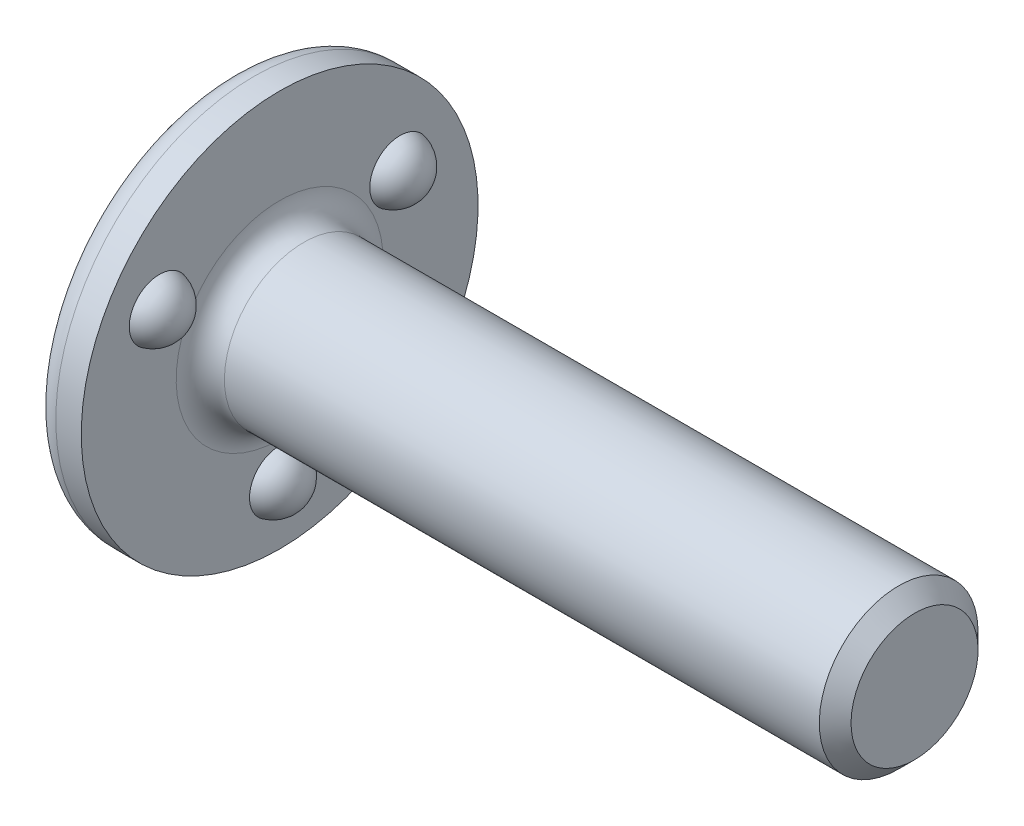
ISO-10303-21;
HEADER;
FILE_DESCRIPTION(('STEP AP214'),'2;1');
FILE_NAME('part.step','',(''),(''),'','','');
FILE_SCHEMA(('AUTOMOTIVE_DESIGN { 1 0 10303 214 1 1 1 1 }'));
ENDSEC;
DATA;
#1=APPLICATION_CONTEXT('core data for automotive mechanical design processes');
#2=APPLICATION_PROTOCOL_DEFINITION('international standard','automotive_design',2000,#1);
#3=PRODUCT_CONTEXT('',#1,'mechanical');
#4=PRODUCT('Part','Part','',(#3));
#5=PRODUCT_RELATED_PRODUCT_CATEGORY('part','',(#4));
#6=PRODUCT_DEFINITION_FORMATION('','',#4);
#7=PRODUCT_DEFINITION_CONTEXT('part definition',#1,'design');
#8=PRODUCT_DEFINITION('design','',#6,#7);
#9=PRODUCT_DEFINITION_SHAPE('','',#8);
#10=(LENGTH_UNIT() NAMED_UNIT(*) SI_UNIT(.MILLI.,.METRE.));
#11=(NAMED_UNIT(*) PLANE_ANGLE_UNIT() SI_UNIT($,.RADIAN.));
#12=(NAMED_UNIT(*) SI_UNIT($,.STERADIAN.) SOLID_ANGLE_UNIT());
#13=UNCERTAINTY_MEASURE_WITH_UNIT(LENGTH_MEASURE(1.E-05),#10,'distance_accuracy_value','');
#14=(GEOMETRIC_REPRESENTATION_CONTEXT(3) GLOBAL_UNCERTAINTY_ASSIGNED_CONTEXT((#13)) GLOBAL_UNIT_ASSIGNED_CONTEXT((#10,
#11,#12)) REPRESENTATION_CONTEXT('',''));
#15=CARTESIAN_POINT('',(0.,0.,0.));
#16=DIRECTION('',(0.,0.,1.));
#17=DIRECTION('',(1.,0.,0.));
#18=AXIS2_PLACEMENT_3D('',#15,#16,#17);
#19=CARTESIAN_POINT('',(0.,0.,0.));
#20=DIRECTION('',(1.,0.,0.));
#21=DIRECTION('',(0.,1.,0.));
#22=AXIS2_PLACEMENT_3D('',#19,#20,#21);
#23=PLANE('',#22);
#24=CARTESIAN_POINT('',(0.,0.,0.));
#25=DIRECTION('',(1.,0.,0.));
#26=DIRECTION('',(0.,1.,0.));
#27=AXIS2_PLACEMENT_3D('',#24,#25,#26);
#28=CIRCLE('',#27,6.9723);
#29=CARTESIAN_POINT('',(0.,6.9723,0.));
#30=VERTEX_POINT('',#29);
#31=EDGE_CURVE('E45',#30,#30,#28,.F.);
#32=ORIENTED_EDGE('',*,*,#31,.T.);
#33=EDGE_LOOP('',(#32));
#34=FACE_BOUND('',#33,.T.);
#35=ADVANCED_FACE('F30',(#34),#23,.F.);
#36=CARTESIAN_POINT('',(0.,0.,0.));
#37=DIRECTION('',(-1.,0.,0.));
#38=DIRECTION('',(0.,-1.,0.));
#39=AXIS2_PLACEMENT_3D('',#36,#37,#38);
#40=CYLINDRICAL_SURFACE('',#39,7.9375);
#41=CARTESIAN_POINT('',(0.9652,0.,0.));
#42=DIRECTION('',(1.,0.,0.));
#43=DIRECTION('',(0.,1.,0.));
#44=AXIS2_PLACEMENT_3D('',#41,#42,#43);
#45=CIRCLE('',#44,7.9375);
#46=CARTESIAN_POINT('',(0.9652,7.9375,0.));
#47=VERTEX_POINT('',#46);
#48=EDGE_CURVE('E41',#47,#47,#45,.T.);
#49=ORIENTED_EDGE('',*,*,#48,.T.);
#50=EDGE_LOOP('',(#49));
#51=FACE_BOUND('',#50,.T.);
#52=CARTESIAN_POINT('',(1.984375,0.,0.));
#53=DIRECTION('',(-1.,0.,0.));
#54=DIRECTION('',(0.,-1.,0.));
#55=AXIS2_PLACEMENT_3D('',#52,#53,#54);
#56=CIRCLE('',#55,7.9375);
#57=CARTESIAN_POINT('',(1.984375,-7.9375,0.));
#58=VERTEX_POINT('',#57);
#59=EDGE_CURVE('E56',#58,#58,#56,.T.);
#60=ORIENTED_EDGE('',*,*,#59,.T.);
#61=EDGE_LOOP('',(#60));
#62=FACE_BOUND('',#61,.T.);
#63=ADVANCED_FACE('F75',(#51,#62),#40,.T.);
#64=CARTESIAN_POINT('',(1.984375,7.9375,0.));
#65=DIRECTION('',(-1.,0.,0.));
#66=DIRECTION('',(0.,-1.,0.));
#67=AXIS2_PLACEMENT_3D('',#64,#65,#66);
#68=PLANE('',#67);
#69=CARTESIAN_POINT('',(1.984375,0.,0.));
#70=DIRECTION('',(-1.,0.,0.));
#71=DIRECTION('',(0.,-1.,0.));
#72=AXIS2_PLACEMENT_3D('',#69,#70,#71);
#73=CIRCLE('',#72,4.1402);
#74=CARTESIAN_POINT('',(1.984375,-4.1402,0.));
#75=VERTEX_POINT('',#74);
#76=EDGE_CURVE('E37',#75,#75,#73,.T.);
#77=ORIENTED_EDGE('',*,*,#76,.T.);
#78=EDGE_LOOP('',(#77));
#79=FACE_BOUND('',#78,.T.);
#80=CARTESIAN_POINT('',(1.984375,2.77812499999996,-4.81185364977731));
#81=DIRECTION('',(1.,0.,0.));
#82=DIRECTION('',(0.,0.866025403784443,0.499999999999992));
#83=AXIS2_PLACEMENT_3D('',#80,#81,#82);
#84=CIRCLE('',#83,1.2065);
#85=CARTESIAN_POINT('',(1.984375,3.82298464966589,-4.20860364977732));
#86=VERTEX_POINT('',#85);
#87=EDGE_CURVE('E65',#86,#86,#84,.T.);
#88=ORIENTED_EDGE('',*,*,#87,.F.);
#89=EDGE_LOOP('',(#88));
#90=FACE_BOUND('',#89,.T.);
#91=CARTESIAN_POINT('',(1.984375,2.77812500000002,4.81185364977728));
#92=DIRECTION('',(1.,0.,0.));
#93=DIRECTION('',(0.,-0.866025403784436,0.500000000000004));
#94=AXIS2_PLACEMENT_3D('',#91,#92,#93);
#95=CIRCLE('',#94,1.2065);
#96=CARTESIAN_POINT('',(1.984375,1.7332653503341,5.41510364977728));
#97=VERTEX_POINT('',#96);
#98=EDGE_CURVE('E62',#97,#97,#95,.T.);
#99=ORIENTED_EDGE('',*,*,#98,.F.);
#100=EDGE_LOOP('',(#99));
#101=FACE_BOUND('',#100,.T.);
#102=CARTESIAN_POINT('',(1.984375,-5.55625,0.));
#103=DIRECTION('',(1.,0.,0.));
#104=DIRECTION('',(0.,0.,-1.));
#105=AXIS2_PLACEMENT_3D('',#102,#103,#104);
#106=CIRCLE('',#105,1.2065);
#107=CARTESIAN_POINT('',(1.984375,-5.55625,-1.2065));
#108=VERTEX_POINT('',#107);
#109=EDGE_CURVE('E59',#108,#108,#106,.T.);
#110=ORIENTED_EDGE('',*,*,#109,.F.);
#111=EDGE_LOOP('',(#110));
#112=FACE_BOUND('',#111,.T.);
#113=ORIENTED_EDGE('',*,*,#59,.F.);
#114=EDGE_LOOP('',(#113));
#115=FACE_BOUND('',#114,.T.);
#116=ADVANCED_FACE('F71',(#79,#90,#101,#112,#115),#68,.F.);
#117=CARTESIAN_POINT('',(0.,0.,0.));
#118=DIRECTION('',(-1.,0.,0.));
#119=DIRECTION('',(0.,-1.,0.));
#120=AXIS2_PLACEMENT_3D('',#117,#118,#119);
#121=CYLINDRICAL_SURFACE('',#120,3.175);
#122=CARTESIAN_POINT('',(2.949575,0.,0.));
#123=DIRECTION('',(-1.,0.,0.));
#124=DIRECTION('',(0.,-1.,0.));
#125=AXIS2_PLACEMENT_3D('',#122,#123,#124);
#126=CIRCLE('',#125,3.175);
#127=CARTESIAN_POINT('',(2.949575,-3.175,0.));
#128=VERTEX_POINT('',#127);
#129=EDGE_CURVE('E10',#128,#128,#126,.F.);
#130=ORIENTED_EDGE('',*,*,#129,.T.);
#131=EDGE_LOOP('',(#130));
#132=FACE_BOUND('',#131,.T.);
#133=CARTESIAN_POINT('',(26.749375,0.,0.));
#134=DIRECTION('',(-1.,0.,0.));
#135=DIRECTION('',(0.,-1.,0.));
#136=AXIS2_PLACEMENT_3D('',#133,#134,#135);
#137=CIRCLE('',#136,3.175);
#138=CARTESIAN_POINT('',(26.749375,-3.175,0.));
#139=VERTEX_POINT('',#138);
#140=EDGE_CURVE('E53',#139,#139,#137,.T.);
#141=ORIENTED_EDGE('',*,*,#140,.T.);
#142=EDGE_LOOP('',(#141));
#143=FACE_BOUND('',#142,.T.);
#144=ADVANCED_FACE('F74',(#132,#143),#121,.T.);
#145=CARTESIAN_POINT('',(27.384375,3.175,0.));
#146=DIRECTION('',(-1.,0.,0.));
#147=DIRECTION('',(0.,-1.,0.));
#148=AXIS2_PLACEMENT_3D('',#145,#146,#147);
#149=PLANE('',#148);
#150=CARTESIAN_POINT('',(27.384375,0.,0.));
#151=DIRECTION('',(-1.,0.,0.));
#152=DIRECTION('',(0.,-1.,0.));
#153=AXIS2_PLACEMENT_3D('',#150,#151,#152);
#154=CIRCLE('',#153,2.53999999999999);
#155=CARTESIAN_POINT('',(27.384375,-2.53999999999999,0.));
#156=VERTEX_POINT('',#155);
#157=EDGE_CURVE('E50',#156,#156,#154,.F.);
#158=ORIENTED_EDGE('',*,*,#157,.T.);
#159=EDGE_LOOP('',(#158));
#160=FACE_BOUND('',#159,.T.);
#161=ADVANCED_FACE('F96',(#160),#149,.F.);
#162=CARTESIAN_POINT('',(26.749375,0.,0.));
#163=DIRECTION('',(-1.,0.,0.));
#164=DIRECTION('',(0.,-1.,0.));
#165=AXIS2_PLACEMENT_3D('',#162,#163,#164);
#166=CONICAL_SURFACE('',#165,3.175,0.785398163397448);
#167=ORIENTED_EDGE('',*,*,#157,.F.);
#168=EDGE_LOOP('',(#167));
#169=FACE_BOUND('',#168,.T.);
#170=ORIENTED_EDGE('',*,*,#140,.F.);
#171=EDGE_LOOP('',(#170));
#172=FACE_BOUND('',#171,.T.);
#173=ADVANCED_FACE('F93',(#169,#172),#166,.T.);
#174=CARTESIAN_POINT('',(1.7129125,-5.55625,0.));
#175=DIRECTION('',(1.,0.,0.));
#176=DIRECTION('',(0.,-1.,0.));
#177=AXIS2_PLACEMENT_3D('',#174,#175,#176);
#178=SPHERICAL_SURFACE('',#177,1.2366625);
#179=ORIENTED_EDGE('',*,*,#109,.T.);
#180=EDGE_LOOP('',(#179));
#181=FACE_BOUND('',#180,.T.);
#182=ADVANCED_FACE('F95',(#181),#178,.T.);
#183=CARTESIAN_POINT('',(1.7129125,2.77812500000002,4.81185364977728));
#184=DIRECTION('',(1.,0.,0.));
#185=DIRECTION('',(0.,0.500000000000004,0.866025403784436));
#186=AXIS2_PLACEMENT_3D('',#183,#184,#185);
#187=SPHERICAL_SURFACE('',#186,1.2366625);
#188=ORIENTED_EDGE('',*,*,#98,.T.);
#189=EDGE_LOOP('',(#188));
#190=FACE_BOUND('',#189,.T.);
#191=ADVANCED_FACE('F106',(#190),#187,.T.);
#192=CARTESIAN_POINT('',(1.7129125,2.77812499999996,-4.81185364977731));
#193=DIRECTION('',(1.,0.,0.));
#194=DIRECTION('',(0.,0.499999999999992,-0.866025403784443));
#195=AXIS2_PLACEMENT_3D('',#192,#193,#194);
#196=SPHERICAL_SURFACE('',#195,1.2366625);
#197=ORIENTED_EDGE('',*,*,#87,.T.);
#198=EDGE_LOOP('',(#197));
#199=FACE_BOUND('',#198,.T.);
#200=ADVANCED_FACE('F69',(#199),#196,.T.);
#201=CARTESIAN_POINT('',(0.9652,0.,0.));
#202=DIRECTION('',(1.,0.,0.));
#203=DIRECTION('',(0.,1.,0.));
#204=AXIS2_PLACEMENT_3D('',#201,#202,#203);
#205=TOROIDAL_SURFACE('',#204,6.9723,0.9652);
#206=ORIENTED_EDGE('',*,*,#48,.F.);
#207=EDGE_LOOP('',(#206));
#208=FACE_BOUND('',#207,.T.);
#209=ORIENTED_EDGE('',*,*,#31,.F.);
#210=EDGE_LOOP('',(#209));
#211=FACE_BOUND('',#210,.T.);
#212=ADVANCED_FACE('F98',(#208,#211),#205,.T.);
#213=CARTESIAN_POINT('',(2.949575,0.,0.));
#214=DIRECTION('',(-1.,0.,0.));
#215=DIRECTION('',(0.,-1.,0.));
#216=AXIS2_PLACEMENT_3D('',#213,#214,#215);
#217=TOROIDAL_SURFACE('',#216,4.1402,0.9652);
#218=ORIENTED_EDGE('',*,*,#129,.F.);
#219=EDGE_LOOP('',(#218));
#220=FACE_BOUND('',#219,.T.);
#221=ORIENTED_EDGE('',*,*,#76,.F.);
#222=EDGE_LOOP('',(#221));
#223=FACE_BOUND('',#222,.T.);
#224=ADVANCED_FACE('F32',(#220,#223),#217,.F.);
#225=CLOSED_SHELL('',(#35,#63,#116,#144,#161,#173,#182,#191,#200,#212,#224));
#226=MANIFOLD_SOLID_BREP('B2',#225);
#227=ADVANCED_BREP_SHAPE_REPRESENTATION('',(#18,#226),#14);
#228=SHAPE_DEFINITION_REPRESENTATION(#9,#227);
ENDSEC;
END-ISO-10303-21;
